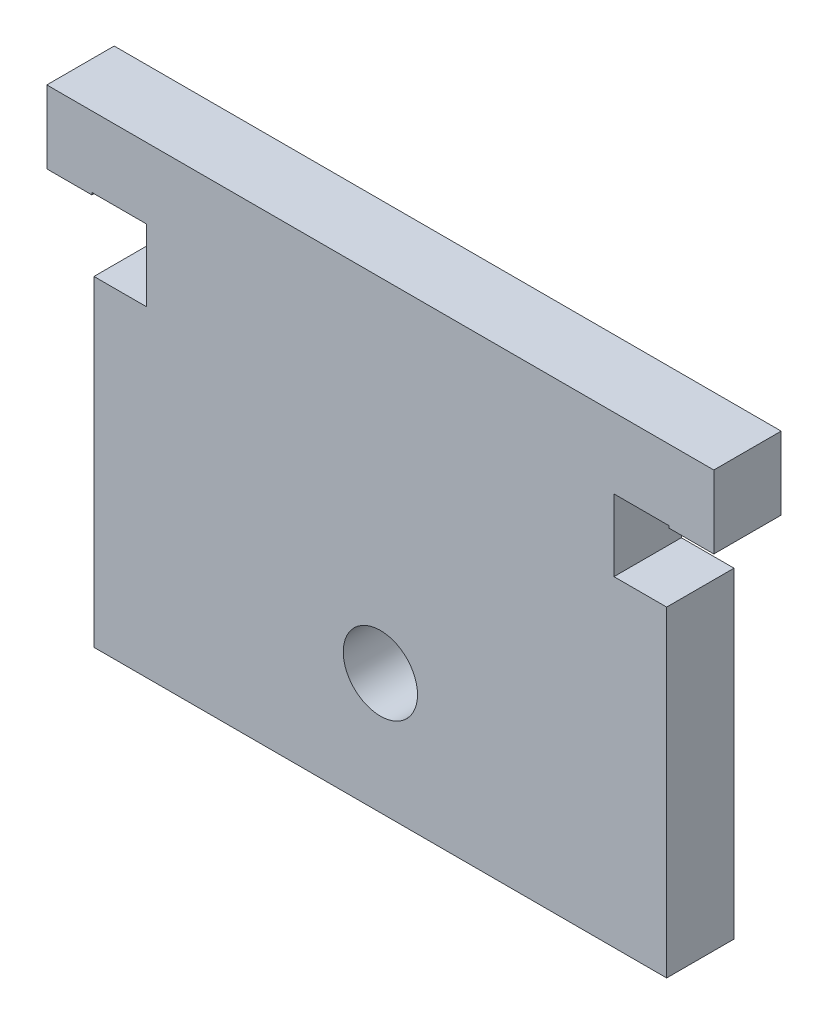
ISO-10303-21;
HEADER;
FILE_DESCRIPTION(('STEP AP214'),'2;1');
FILE_NAME('part.step','',(''),(''),'','','');
FILE_SCHEMA(('AUTOMOTIVE_DESIGN { 1 0 10303 214 1 1 1 1 }'));
ENDSEC;
DATA;
#1=APPLICATION_CONTEXT('core data for automotive mechanical design processes');
#2=APPLICATION_PROTOCOL_DEFINITION('international standard','automotive_design',2000,#1);
#3=PRODUCT_CONTEXT('',#1,'mechanical');
#4=PRODUCT('Part','Part','',(#3));
#5=PRODUCT_RELATED_PRODUCT_CATEGORY('part','',(#4));
#6=PRODUCT_DEFINITION_FORMATION('','',#4);
#7=PRODUCT_DEFINITION_CONTEXT('part definition',#1,'design');
#8=PRODUCT_DEFINITION('design','',#6,#7);
#9=PRODUCT_DEFINITION_SHAPE('','',#8);
#10=(LENGTH_UNIT() NAMED_UNIT(*) SI_UNIT(.MILLI.,.METRE.));
#11=(NAMED_UNIT(*) PLANE_ANGLE_UNIT() SI_UNIT($,.RADIAN.));
#12=(NAMED_UNIT(*) SI_UNIT($,.STERADIAN.) SOLID_ANGLE_UNIT());
#13=UNCERTAINTY_MEASURE_WITH_UNIT(LENGTH_MEASURE(1.E-05),#10,'distance_accuracy_value','');
#14=(GEOMETRIC_REPRESENTATION_CONTEXT(3) GLOBAL_UNCERTAINTY_ASSIGNED_CONTEXT((#13)) GLOBAL_UNIT_ASSIGNED_CONTEXT((#10,
#11,#12)) REPRESENTATION_CONTEXT('',''));
#15=CARTESIAN_POINT('',(0.,0.,0.));
#16=DIRECTION('',(0.,0.,1.));
#17=DIRECTION('',(1.,0.,0.));
#18=AXIS2_PLACEMENT_3D('',#15,#16,#17);
#19=CARTESIAN_POINT('',(0.,0.,6.35));
#20=DIRECTION('',(0.,0.,-1.));
#21=DIRECTION('',(-1.,0.,0.));
#22=AXIS2_PLACEMENT_3D('',#19,#20,#21);
#23=PLANE('',#22);
#24=CARTESIAN_POINT('',(0.00591999999668975,-7.666260004,6.35));
#25=DIRECTION('',(0.,0.,1.));
#26=DIRECTION('',(1.,0.,0.));
#27=AXIS2_PLACEMENT_3D('',#24,#25,#26);
#28=CIRCLE('',#27,3.49999999999999);
#29=CARTESIAN_POINT('',(3.50591999999668,-7.666260004,6.35));
#30=VERTEX_POINT('',#29);
#31=EDGE_CURVE('E192',#30,#30,#28,.T.);
#32=ORIENTED_EDGE('',*,*,#31,.F.);
#33=EDGE_LOOP('',(#32));
#34=FACE_BOUND('',#33,.T.);
#35=DIRECTION('',(0.,1.,0.));
#36=VECTOR('',#35,1.);
#37=CARTESIAN_POINT('',(-22.0218,17.9832,6.35));
#38=LINE('',#37,#36);
#39=CARTESIAN_POINT('',(-22.0218,11.2268,6.35));
#40=VERTEX_POINT('',#39);
#41=CARTESIAN_POINT('',(-22.0218,17.9832,6.35));
#42=VERTEX_POINT('',#41);
#43=EDGE_CURVE('E162',#40,#42,#38,.T.);
#44=ORIENTED_EDGE('',*,*,#43,.F.);
#45=DIRECTION('',(1.,0.,0.));
#46=VECTOR('',#45,1.);
#47=CARTESIAN_POINT('',(-22.0218,11.2268,6.35));
#48=LINE('',#47,#46);
#49=CARTESIAN_POINT('',(-26.9875,11.2268,6.35));
#50=VERTEX_POINT('',#49);
#51=EDGE_CURVE('E179',#50,#40,#48,.T.);
#52=ORIENTED_EDGE('',*,*,#51,.F.);
#53=DIRECTION('',(0.,1.,0.));
#54=VECTOR('',#53,1.);
#55=CARTESIAN_POINT('',(-26.9875,-25.4,6.35));
#56=LINE('',#55,#54);
#57=CARTESIAN_POINT('',(-26.9875,-19.05,6.35));
#58=VERTEX_POINT('',#57);
#59=EDGE_CURVE('E270',#58,#50,#56,.T.);
#60=ORIENTED_EDGE('',*,*,#59,.F.);
#61=DIRECTION('',(-1.,0.,0.));
#62=VECTOR('',#61,1.);
#63=CARTESIAN_POINT('',(-26.9875,-19.05,6.35));
#64=LINE('',#63,#62);
#65=CARTESIAN_POINT('',(26.9875,-19.05,6.35));
#66=VERTEX_POINT('',#65);
#67=EDGE_CURVE('E233',#66,#58,#64,.T.);
#68=ORIENTED_EDGE('',*,*,#67,.F.);
#69=DIRECTION('',(0.,-1.,0.));
#70=VECTOR('',#69,1.);
#71=CARTESIAN_POINT('',(26.9875,-25.4,6.35));
#72=LINE('',#71,#70);
#73=CARTESIAN_POINT('',(26.9875,11.2268,6.35));
#74=VERTEX_POINT('',#73);
#75=EDGE_CURVE('E275',#74,#66,#72,.T.);
#76=ORIENTED_EDGE('',*,*,#75,.F.);
#77=DIRECTION('',(1.,0.,0.));
#78=VECTOR('',#77,1.);
#79=CARTESIAN_POINT('',(22.0218,11.2268,6.35));
#80=LINE('',#79,#78);
#81=CARTESIAN_POINT('',(22.0218,11.2268,6.35));
#82=VERTEX_POINT('',#81);
#83=EDGE_CURVE('E203',#82,#74,#80,.T.);
#84=ORIENTED_EDGE('',*,*,#83,.F.);
#85=DIRECTION('',(0.,-1.,0.));
#86=VECTOR('',#85,1.);
#87=CARTESIAN_POINT('',(22.0218,17.9832,6.35));
#88=LINE('',#87,#86);
#89=CARTESIAN_POINT('',(22.0218,17.9832,6.35));
#90=VERTEX_POINT('',#89);
#91=EDGE_CURVE('E206',#90,#82,#88,.T.);
#92=ORIENTED_EDGE('',*,*,#91,.F.);
#93=DIRECTION('',(-1.,0.,0.));
#94=VECTOR('',#93,1.);
#95=CARTESIAN_POINT('',(22.0218,17.9832,6.35));
#96=LINE('',#95,#94);
#97=CARTESIAN_POINT('',(27.1907,17.9832,6.35));
#98=VERTEX_POINT('',#97);
#99=EDGE_CURVE('E187',#98,#90,#96,.T.);
#100=ORIENTED_EDGE('',*,*,#99,.F.);
#101=DIRECTION('',(0.,1.,0.));
#102=VECTOR('',#101,1.);
#103=CARTESIAN_POINT('',(27.1907,17.9832,6.35));
#104=LINE('',#103,#102);
#105=CARTESIAN_POINT('',(27.1907,17.78,6.35));
#106=VERTEX_POINT('',#105);
#107=EDGE_CURVE('E201',#106,#98,#104,.T.);
#108=ORIENTED_EDGE('',*,*,#107,.F.);
#109=DIRECTION('',(-1.,0.,0.));
#110=VECTOR('',#109,1.);
#111=CARTESIAN_POINT('',(42.8625,17.78,6.35));
#112=LINE('',#111,#110);
#113=CARTESIAN_POINT('',(31.4325,17.78,6.35));
#114=VERTEX_POINT('',#113);
#115=EDGE_CURVE('E273',#114,#106,#112,.T.);
#116=ORIENTED_EDGE('',*,*,#115,.F.);
#117=DIRECTION('',(0.,1.,0.));
#118=VECTOR('',#117,1.);
#119=CARTESIAN_POINT('',(31.4325,24.638,6.35));
#120=LINE('',#119,#118);
#121=CARTESIAN_POINT('',(31.4325,24.638,6.35));
#122=VERTEX_POINT('',#121);
#123=EDGE_CURVE('E241',#114,#122,#120,.T.);
#124=ORIENTED_EDGE('',*,*,#123,.T.);
#125=DIRECTION('',(1.,0.,0.));
#126=VECTOR('',#125,1.);
#127=CARTESIAN_POINT('',(-42.8625,24.638,6.35));
#128=LINE('',#127,#126);
#129=CARTESIAN_POINT('',(-31.4325,24.638,6.35));
#130=VERTEX_POINT('',#129);
#131=EDGE_CURVE('E258',#130,#122,#128,.T.);
#132=ORIENTED_EDGE('',*,*,#131,.F.);
#133=DIRECTION('',(0.,1.,0.));
#134=VECTOR('',#133,1.);
#135=CARTESIAN_POINT('',(-31.4325,24.638,6.35));
#136=LINE('',#135,#134);
#137=CARTESIAN_POINT('',(-31.4325,17.78,6.35));
#138=VERTEX_POINT('',#137);
#139=EDGE_CURVE('E253',#138,#130,#136,.T.);
#140=ORIENTED_EDGE('',*,*,#139,.F.);
#141=DIRECTION('',(-1.,0.,0.));
#142=VECTOR('',#141,1.);
#143=CARTESIAN_POINT('',(-42.8625,17.78,6.35));
#144=LINE('',#143,#142);
#145=CARTESIAN_POINT('',(-27.1907,17.78,6.35));
#146=VERTEX_POINT('',#145);
#147=EDGE_CURVE('E267',#146,#138,#144,.T.);
#148=ORIENTED_EDGE('',*,*,#147,.F.);
#149=DIRECTION('',(0.,-1.,0.));
#150=VECTOR('',#149,1.);
#151=CARTESIAN_POINT('',(-27.1907,17.9832,6.35));
#152=LINE('',#151,#150);
#153=CARTESIAN_POINT('',(-27.1907,17.9832,6.35));
#154=VERTEX_POINT('',#153);
#155=EDGE_CURVE('E64',#154,#146,#152,.T.);
#156=ORIENTED_EDGE('',*,*,#155,.F.);
#157=DIRECTION('',(-1.,0.,0.));
#158=VECTOR('',#157,1.);
#159=CARTESIAN_POINT('',(-22.0218,17.9832,6.35));
#160=LINE('',#159,#158);
#161=EDGE_CURVE('E186',#42,#154,#160,.T.);
#162=ORIENTED_EDGE('',*,*,#161,.F.);
#163=EDGE_LOOP('',(#44,#52,#60,#68,#76,#84,#92,#100,#108,#116,#124,#132,#140,#148,#156,#162));
#164=FACE_BOUND('',#163,.T.);
#165=ADVANCED_FACE('F41',(#34,#164),#23,.F.);
#166=CARTESIAN_POINT('',(0.,0.,0.));
#167=DIRECTION('',(0.,0.,-1.));
#168=DIRECTION('',(-1.,0.,0.));
#169=AXIS2_PLACEMENT_3D('',#166,#167,#168);
#170=PLANE('',#169);
#171=DIRECTION('',(1.,0.,0.));
#172=VECTOR('',#171,1.);
#173=CARTESIAN_POINT('',(-22.0218,11.2268,0.));
#174=LINE('',#173,#172);
#175=CARTESIAN_POINT('',(-26.9875,11.2268,0.));
#176=VERTEX_POINT('',#175);
#177=CARTESIAN_POINT('',(-22.0218,11.2268,0.));
#178=VERTEX_POINT('',#177);
#179=EDGE_CURVE('E167',#176,#178,#174,.T.);
#180=ORIENTED_EDGE('',*,*,#179,.T.);
#181=DIRECTION('',(0.,1.,0.));
#182=VECTOR('',#181,1.);
#183=CARTESIAN_POINT('',(-22.0218,17.9832,0.));
#184=LINE('',#183,#182);
#185=CARTESIAN_POINT('',(-22.0218,17.9832,0.));
#186=VERTEX_POINT('',#185);
#187=EDGE_CURVE('E159',#178,#186,#184,.T.);
#188=ORIENTED_EDGE('',*,*,#187,.T.);
#189=DIRECTION('',(-1.,0.,0.));
#190=VECTOR('',#189,1.);
#191=CARTESIAN_POINT('',(-22.0218,17.9832,0.));
#192=LINE('',#191,#190);
#193=CARTESIAN_POINT('',(-27.1907,17.9832,0.));
#194=VERTEX_POINT('',#193);
#195=EDGE_CURVE('E170',#186,#194,#192,.T.);
#196=ORIENTED_EDGE('',*,*,#195,.T.);
#197=DIRECTION('',(0.,-1.,0.));
#198=VECTOR('',#197,1.);
#199=CARTESIAN_POINT('',(-27.1907,17.9832,0.));
#200=LINE('',#199,#198);
#201=CARTESIAN_POINT('',(-27.1907,17.78,0.));
#202=VERTEX_POINT('',#201);
#203=EDGE_CURVE('E175',#194,#202,#200,.T.);
#204=ORIENTED_EDGE('',*,*,#203,.T.);
#205=DIRECTION('',(-1.,0.,0.));
#206=VECTOR('',#205,1.);
#207=CARTESIAN_POINT('',(-42.8625,17.78,0.));
#208=LINE('',#207,#206);
#209=CARTESIAN_POINT('',(-31.4325,17.78,0.));
#210=VERTEX_POINT('',#209);
#211=EDGE_CURVE('E266',#202,#210,#208,.T.);
#212=ORIENTED_EDGE('',*,*,#211,.T.);
#213=DIRECTION('',(0.,-1.,0.));
#214=VECTOR('',#213,1.);
#215=CARTESIAN_POINT('',(-31.4325,24.638,0.));
#216=LINE('',#215,#214);
#217=CARTESIAN_POINT('',(-31.4325,24.638,0.));
#218=VERTEX_POINT('',#217);
#219=EDGE_CURVE('E247',#218,#210,#216,.T.);
#220=ORIENTED_EDGE('',*,*,#219,.F.);
#221=DIRECTION('',(-1.,0.,0.));
#222=VECTOR('',#221,1.);
#223=CARTESIAN_POINT('',(-42.8625,24.638,0.));
#224=LINE('',#223,#222);
#225=CARTESIAN_POINT('',(31.4325,24.638,0.));
#226=VERTEX_POINT('',#225);
#227=EDGE_CURVE('E261',#226,#218,#224,.T.);
#228=ORIENTED_EDGE('',*,*,#227,.F.);
#229=DIRECTION('',(0.,-1.,0.));
#230=VECTOR('',#229,1.);
#231=CARTESIAN_POINT('',(31.4325,24.638,0.));
#232=LINE('',#231,#230);
#233=CARTESIAN_POINT('',(31.4325,17.78,0.));
#234=VERTEX_POINT('',#233);
#235=EDGE_CURVE('E235',#226,#234,#232,.T.);
#236=ORIENTED_EDGE('',*,*,#235,.T.);
#237=DIRECTION('',(-1.,0.,0.));
#238=VECTOR('',#237,1.);
#239=CARTESIAN_POINT('',(42.8625,17.78,0.));
#240=LINE('',#239,#238);
#241=CARTESIAN_POINT('',(27.1907,17.78,0.));
#242=VERTEX_POINT('',#241);
#243=EDGE_CURVE('E277',#234,#242,#240,.T.);
#244=ORIENTED_EDGE('',*,*,#243,.T.);
#245=DIRECTION('',(0.,1.,0.));
#246=VECTOR('',#245,1.);
#247=CARTESIAN_POINT('',(27.1907,17.9832,0.));
#248=LINE('',#247,#246);
#249=CARTESIAN_POINT('',(27.1907,17.9832,0.));
#250=VERTEX_POINT('',#249);
#251=EDGE_CURVE('E56',#242,#250,#248,.T.);
#252=ORIENTED_EDGE('',*,*,#251,.T.);
#253=DIRECTION('',(-1.,0.,0.));
#254=VECTOR('',#253,1.);
#255=CARTESIAN_POINT('',(22.0218,17.9832,0.));
#256=LINE('',#255,#254);
#257=CARTESIAN_POINT('',(22.0218,17.9832,0.));
#258=VERTEX_POINT('',#257);
#259=EDGE_CURVE('E204',#250,#258,#256,.T.);
#260=ORIENTED_EDGE('',*,*,#259,.T.);
#261=DIRECTION('',(0.,-1.,0.));
#262=VECTOR('',#261,1.);
#263=CARTESIAN_POINT('',(22.0218,17.9832,0.));
#264=LINE('',#263,#262);
#265=CARTESIAN_POINT('',(22.0218,11.2268,0.));
#266=VERTEX_POINT('',#265);
#267=EDGE_CURVE('E215',#258,#266,#264,.T.);
#268=ORIENTED_EDGE('',*,*,#267,.T.);
#269=DIRECTION('',(1.,0.,0.));
#270=VECTOR('',#269,1.);
#271=CARTESIAN_POINT('',(22.0218,11.2268,0.));
#272=LINE('',#271,#270);
#273=CARTESIAN_POINT('',(26.9875,11.2268,0.));
#274=VERTEX_POINT('',#273);
#275=EDGE_CURVE('E212',#266,#274,#272,.T.);
#276=ORIENTED_EDGE('',*,*,#275,.T.);
#277=DIRECTION('',(0.,-1.,0.));
#278=VECTOR('',#277,1.);
#279=CARTESIAN_POINT('',(26.9875,-25.4,0.));
#280=LINE('',#279,#278);
#281=CARTESIAN_POINT('',(26.9875,-19.05,0.));
#282=VERTEX_POINT('',#281);
#283=EDGE_CURVE('E263',#274,#282,#280,.T.);
#284=ORIENTED_EDGE('',*,*,#283,.T.);
#285=DIRECTION('',(1.,0.,0.));
#286=VECTOR('',#285,1.);
#287=CARTESIAN_POINT('',(-26.9875,-19.05,0.));
#288=LINE('',#287,#286);
#289=CARTESIAN_POINT('',(-26.9875,-19.05,0.));
#290=VERTEX_POINT('',#289);
#291=EDGE_CURVE('E227',#290,#282,#288,.T.);
#292=ORIENTED_EDGE('',*,*,#291,.F.);
#293=DIRECTION('',(0.,1.,0.));
#294=VECTOR('',#293,1.);
#295=CARTESIAN_POINT('',(-26.9875,-25.4,0.));
#296=LINE('',#295,#294);
#297=EDGE_CURVE('E264',#290,#176,#296,.T.);
#298=ORIENTED_EDGE('',*,*,#297,.T.);
#299=EDGE_LOOP('',(#180,#188,#196,#204,#212,#220,#228,#236,#244,#252,#260,#268,#276,#284,#292,#298));
#300=FACE_BOUND('',#299,.T.);
#301=CARTESIAN_POINT('',(0.00591999999668975,-7.666260004,0.));
#302=DIRECTION('',(0.,0.,1.));
#303=DIRECTION('',(1.,0.,0.));
#304=AXIS2_PLACEMENT_3D('',#301,#302,#303);
#305=CIRCLE('',#304,3.5);
#306=CARTESIAN_POINT('',(3.50591999999669,-7.666260004,0.));
#307=VERTEX_POINT('',#306);
#308=EDGE_CURVE('E222',#307,#307,#305,.T.);
#309=ORIENTED_EDGE('',*,*,#308,.T.);
#310=EDGE_LOOP('',(#309));
#311=FACE_BOUND('',#310,.T.);
#312=ADVANCED_FACE('F43',(#300,#311),#170,.T.);
#313=CARTESIAN_POINT('',(26.9875,-25.4,0.));
#314=DIRECTION('',(-1.,0.,0.));
#315=DIRECTION('',(0.,0.,1.));
#316=AXIS2_PLACEMENT_3D('',#313,#314,#315);
#317=PLANE('',#316);
#318=ORIENTED_EDGE('',*,*,#283,.F.);
#319=DIRECTION('',(0.,0.,1.));
#320=VECTOR('',#319,1.);
#321=CARTESIAN_POINT('',(26.9875,11.2268,0.));
#322=LINE('',#321,#320);
#323=EDGE_CURVE('E11',#274,#74,#322,.T.);
#324=ORIENTED_EDGE('',*,*,#323,.T.);
#325=ORIENTED_EDGE('',*,*,#75,.T.);
#326=DIRECTION('',(0.,0.,1.));
#327=VECTOR('',#326,1.);
#328=CARTESIAN_POINT('',(26.9875,-19.05,6.35));
#329=LINE('',#328,#327);
#330=EDGE_CURVE('E230',#282,#66,#329,.T.);
#331=ORIENTED_EDGE('',*,*,#330,.F.);
#332=EDGE_LOOP('',(#318,#324,#325,#331));
#333=FACE_BOUND('',#332,.T.);
#334=ADVANCED_FACE('F300',(#333),#317,.F.);
#335=CARTESIAN_POINT('',(-26.9875,-25.4,0.));
#336=DIRECTION('',(1.,0.,0.));
#337=DIRECTION('',(0.,0.,-1.));
#338=AXIS2_PLACEMENT_3D('',#335,#336,#337);
#339=PLANE('',#338);
#340=ORIENTED_EDGE('',*,*,#59,.T.);
#341=DIRECTION('',(0.,0.,-1.));
#342=VECTOR('',#341,1.);
#343=CARTESIAN_POINT('',(-26.9875,11.2268,0.));
#344=LINE('',#343,#342);
#345=EDGE_CURVE('E49',#50,#176,#344,.T.);
#346=ORIENTED_EDGE('',*,*,#345,.T.);
#347=ORIENTED_EDGE('',*,*,#297,.F.);
#348=DIRECTION('',(0.,0.,-1.));
#349=VECTOR('',#348,1.);
#350=CARTESIAN_POINT('',(-26.9875,-19.05,6.35));
#351=LINE('',#350,#349);
#352=EDGE_CURVE('E225',#58,#290,#351,.T.);
#353=ORIENTED_EDGE('',*,*,#352,.F.);
#354=EDGE_LOOP('',(#340,#346,#347,#353));
#355=FACE_BOUND('',#354,.T.);
#356=ADVANCED_FACE('F288',(#355),#339,.F.);
#357=CARTESIAN_POINT('',(0.,24.638,0.));
#358=DIRECTION('',(0.,1.,0.));
#359=DIRECTION('',(0.,0.,1.));
#360=AXIS2_PLACEMENT_3D('',#357,#358,#359);
#361=PLANE('',#360);
#362=ORIENTED_EDGE('',*,*,#131,.T.);
#363=DIRECTION('',(0.,0.,-1.));
#364=VECTOR('',#363,1.);
#365=CARTESIAN_POINT('',(31.4325,24.638,0.));
#366=LINE('',#365,#364);
#367=EDGE_CURVE('E238',#122,#226,#366,.T.);
#368=ORIENTED_EDGE('',*,*,#367,.T.);
#369=ORIENTED_EDGE('',*,*,#227,.T.);
#370=DIRECTION('',(0.,0.,-1.));
#371=VECTOR('',#370,1.);
#372=CARTESIAN_POINT('',(-31.4325,24.638,0.));
#373=LINE('',#372,#371);
#374=EDGE_CURVE('E255',#130,#218,#373,.T.);
#375=ORIENTED_EDGE('',*,*,#374,.F.);
#376=EDGE_LOOP('',(#362,#368,#369,#375));
#377=FACE_BOUND('',#376,.T.);
#378=ADVANCED_FACE('F331',(#377),#361,.T.);
#379=CARTESIAN_POINT('',(42.8625,17.78,0.));
#380=DIRECTION('',(0.,1.,0.));
#381=DIRECTION('',(-1.,0.,0.));
#382=AXIS2_PLACEMENT_3D('',#379,#380,#381);
#383=PLANE('',#382);
#384=ORIENTED_EDGE('',*,*,#115,.T.);
#385=DIRECTION('',(0.,0.,-1.));
#386=VECTOR('',#385,1.);
#387=CARTESIAN_POINT('',(27.1907,17.78,0.));
#388=LINE('',#387,#386);
#389=EDGE_CURVE('E284',#106,#242,#388,.T.);
#390=ORIENTED_EDGE('',*,*,#389,.T.);
#391=ORIENTED_EDGE('',*,*,#243,.F.);
#392=DIRECTION('',(0.,0.,1.));
#393=VECTOR('',#392,1.);
#394=CARTESIAN_POINT('',(31.4325,17.78,0.));
#395=LINE('',#394,#393);
#396=EDGE_CURVE('E244',#234,#114,#395,.T.);
#397=ORIENTED_EDGE('',*,*,#396,.T.);
#398=EDGE_LOOP('',(#384,#390,#391,#397));
#399=FACE_BOUND('',#398,.T.);
#400=ADVANCED_FACE('F327',(#399),#383,.F.);
#401=CARTESIAN_POINT('',(-42.8625,17.78,0.));
#402=DIRECTION('',(0.,1.,0.));
#403=DIRECTION('',(0.,0.,1.));
#404=AXIS2_PLACEMENT_3D('',#401,#402,#403);
#405=PLANE('',#404);
#406=ORIENTED_EDGE('',*,*,#211,.F.);
#407=DIRECTION('',(0.,0.,1.));
#408=VECTOR('',#407,1.);
#409=CARTESIAN_POINT('',(-27.1907,17.78,0.));
#410=LINE('',#409,#408);
#411=EDGE_CURVE('E269',#202,#146,#410,.T.);
#412=ORIENTED_EDGE('',*,*,#411,.T.);
#413=ORIENTED_EDGE('',*,*,#147,.T.);
#414=DIRECTION('',(0.,0.,1.));
#415=VECTOR('',#414,1.);
#416=CARTESIAN_POINT('',(-31.4325,17.78,0.));
#417=LINE('',#416,#415);
#418=EDGE_CURVE('E250',#210,#138,#417,.T.);
#419=ORIENTED_EDGE('',*,*,#418,.F.);
#420=EDGE_LOOP('',(#406,#412,#413,#419));
#421=FACE_BOUND('',#420,.T.);
#422=ADVANCED_FACE('F330',(#421),#405,.F.);
#423=CARTESIAN_POINT('',(-31.4325,0.,0.));
#424=DIRECTION('',(-1.,0.,0.));
#425=DIRECTION('',(0.,0.,1.));
#426=AXIS2_PLACEMENT_3D('',#423,#424,#425);
#427=PLANE('',#426);
#428=ORIENTED_EDGE('',*,*,#219,.T.);
#429=ORIENTED_EDGE('',*,*,#418,.T.);
#430=ORIENTED_EDGE('',*,*,#139,.T.);
#431=ORIENTED_EDGE('',*,*,#374,.T.);
#432=EDGE_LOOP('',(#428,#429,#430,#431));
#433=FACE_BOUND('',#432,.T.);
#434=ADVANCED_FACE('F336',(#433),#427,.T.);
#435=CARTESIAN_POINT('',(31.4325,0.,0.));
#436=DIRECTION('',(1.,0.,0.));
#437=DIRECTION('',(0.,0.,1.));
#438=AXIS2_PLACEMENT_3D('',#435,#436,#437);
#439=PLANE('',#438);
#440=ORIENTED_EDGE('',*,*,#235,.F.);
#441=ORIENTED_EDGE('',*,*,#367,.F.);
#442=ORIENTED_EDGE('',*,*,#123,.F.);
#443=ORIENTED_EDGE('',*,*,#396,.F.);
#444=EDGE_LOOP('',(#440,#441,#442,#443));
#445=FACE_BOUND('',#444,.T.);
#446=ADVANCED_FACE('F343',(#445),#439,.T.);
#447=CARTESIAN_POINT('',(0.,-19.05,0.));
#448=DIRECTION('',(0.,-1.,0.));
#449=DIRECTION('',(0.,0.,-1.));
#450=AXIS2_PLACEMENT_3D('',#447,#448,#449);
#451=PLANE('',#450);
#452=ORIENTED_EDGE('',*,*,#352,.T.);
#453=ORIENTED_EDGE('',*,*,#291,.T.);
#454=ORIENTED_EDGE('',*,*,#330,.T.);
#455=ORIENTED_EDGE('',*,*,#67,.T.);
#456=EDGE_LOOP('',(#452,#453,#454,#455));
#457=FACE_BOUND('',#456,.T.);
#458=ADVANCED_FACE('F297',(#457),#451,.T.);
#459=CARTESIAN_POINT('',(0.00591999999668975,-7.666260004,6.35));
#460=DIRECTION('',(0.,0.,1.));
#461=DIRECTION('',(1.,0.,0.));
#462=AXIS2_PLACEMENT_3D('',#459,#460,#461);
#463=CYLINDRICAL_SURFACE('',#462,3.49999999999999);
#464=ORIENTED_EDGE('',*,*,#308,.F.);
#465=EDGE_LOOP('',(#464));
#466=FACE_BOUND('',#465,.T.);
#467=ORIENTED_EDGE('',*,*,#31,.T.);
#468=EDGE_LOOP('',(#467));
#469=FACE_BOUND('',#468,.T.);
#470=ADVANCED_FACE('F308',(#466,#469),#463,.F.);
#471=CARTESIAN_POINT('',(-22.0218,11.2268,0.));
#472=DIRECTION('',(0.,-1.,0.));
#473=DIRECTION('',(0.,0.,-1.));
#474=AXIS2_PLACEMENT_3D('',#471,#472,#473);
#475=PLANE('',#474);
#476=ORIENTED_EDGE('',*,*,#51,.T.);
#477=DIRECTION('',(0.,0.,1.));
#478=VECTOR('',#477,1.);
#479=CARTESIAN_POINT('',(-22.0218,11.2268,0.));
#480=LINE('',#479,#478);
#481=EDGE_CURVE('E190',#178,#40,#480,.T.);
#482=ORIENTED_EDGE('',*,*,#481,.F.);
#483=ORIENTED_EDGE('',*,*,#179,.F.);
#484=ORIENTED_EDGE('',*,*,#345,.F.);
#485=EDGE_LOOP('',(#476,#482,#483,#484));
#486=FACE_BOUND('',#485,.T.);
#487=ADVANCED_FACE('F305',(#486),#475,.F.);
#488=CARTESIAN_POINT('',(-27.1907,17.9832,0.));
#489=DIRECTION('',(-1.,0.,0.));
#490=DIRECTION('',(0.,0.,1.));
#491=AXIS2_PLACEMENT_3D('',#488,#489,#490);
#492=PLANE('',#491);
#493=ORIENTED_EDGE('',*,*,#203,.F.);
#494=DIRECTION('',(0.,0.,1.));
#495=VECTOR('',#494,1.);
#496=CARTESIAN_POINT('',(-27.1907,17.9832,0.));
#497=LINE('',#496,#495);
#498=EDGE_CURVE('E166',#194,#154,#497,.T.);
#499=ORIENTED_EDGE('',*,*,#498,.T.);
#500=ORIENTED_EDGE('',*,*,#155,.T.);
#501=ORIENTED_EDGE('',*,*,#411,.F.);
#502=EDGE_LOOP('',(#493,#499,#500,#501));
#503=FACE_BOUND('',#502,.T.);
#504=ADVANCED_FACE('F307',(#503),#492,.F.);
#505=CARTESIAN_POINT('',(-22.0218,17.9832,0.));
#506=DIRECTION('',(1.,0.,0.));
#507=DIRECTION('',(0.,0.,-1.));
#508=AXIS2_PLACEMENT_3D('',#505,#506,#507);
#509=PLANE('',#508);
#510=ORIENTED_EDGE('',*,*,#43,.T.);
#511=DIRECTION('',(0.,0.,1.));
#512=VECTOR('',#511,1.);
#513=CARTESIAN_POINT('',(-22.0218,17.9832,0.));
#514=LINE('',#513,#512);
#515=EDGE_CURVE('E154',#186,#42,#514,.T.);
#516=ORIENTED_EDGE('',*,*,#515,.F.);
#517=ORIENTED_EDGE('',*,*,#187,.F.);
#518=ORIENTED_EDGE('',*,*,#481,.T.);
#519=EDGE_LOOP('',(#510,#516,#517,#518));
#520=FACE_BOUND('',#519,.T.);
#521=ADVANCED_FACE('F156',(#520),#509,.F.);
#522=CARTESIAN_POINT('',(-22.0218,17.9832,0.));
#523=DIRECTION('',(0.,1.,0.));
#524=DIRECTION('',(0.,0.,1.));
#525=AXIS2_PLACEMENT_3D('',#522,#523,#524);
#526=PLANE('',#525);
#527=ORIENTED_EDGE('',*,*,#161,.T.);
#528=ORIENTED_EDGE('',*,*,#498,.F.);
#529=ORIENTED_EDGE('',*,*,#195,.F.);
#530=ORIENTED_EDGE('',*,*,#515,.T.);
#531=EDGE_LOOP('',(#527,#528,#529,#530));
#532=FACE_BOUND('',#531,.T.);
#533=ADVANCED_FACE('F171',(#532),#526,.F.);
#534=CARTESIAN_POINT('',(22.0218,11.2268,0.));
#535=DIRECTION('',(0.,-1.,0.));
#536=DIRECTION('',(0.,0.,-1.));
#537=AXIS2_PLACEMENT_3D('',#534,#535,#536);
#538=PLANE('',#537);
#539=ORIENTED_EDGE('',*,*,#275,.F.);
#540=DIRECTION('',(0.,0.,1.));
#541=VECTOR('',#540,1.);
#542=CARTESIAN_POINT('',(22.0218,11.2268,0.));
#543=LINE('',#542,#541);
#544=EDGE_CURVE('E196',#266,#82,#543,.T.);
#545=ORIENTED_EDGE('',*,*,#544,.T.);
#546=ORIENTED_EDGE('',*,*,#83,.T.);
#547=ORIENTED_EDGE('',*,*,#323,.F.);
#548=EDGE_LOOP('',(#539,#545,#546,#547));
#549=FACE_BOUND('',#548,.T.);
#550=ADVANCED_FACE('F354',(#549),#538,.F.);
#551=CARTESIAN_POINT('',(27.1907,17.9832,0.));
#552=DIRECTION('',(1.,0.,0.));
#553=DIRECTION('',(0.,0.,-1.));
#554=AXIS2_PLACEMENT_3D('',#551,#552,#553);
#555=PLANE('',#554);
#556=ORIENTED_EDGE('',*,*,#107,.T.);
#557=DIRECTION('',(0.,0.,1.));
#558=VECTOR('',#557,1.);
#559=CARTESIAN_POINT('',(27.1907,17.9832,0.));
#560=LINE('',#559,#558);
#561=EDGE_CURVE('E198',#250,#98,#560,.T.);
#562=ORIENTED_EDGE('',*,*,#561,.F.);
#563=ORIENTED_EDGE('',*,*,#251,.F.);
#564=ORIENTED_EDGE('',*,*,#389,.F.);
#565=EDGE_LOOP('',(#556,#562,#563,#564));
#566=FACE_BOUND('',#565,.T.);
#567=ADVANCED_FACE('F350',(#566),#555,.F.);
#568=CARTESIAN_POINT('',(22.0218,17.9832,0.));
#569=DIRECTION('',(0.,1.,0.));
#570=DIRECTION('',(0.,0.,1.));
#571=AXIS2_PLACEMENT_3D('',#568,#569,#570);
#572=PLANE('',#571);
#573=ORIENTED_EDGE('',*,*,#99,.T.);
#574=DIRECTION('',(0.,0.,1.));
#575=VECTOR('',#574,1.);
#576=CARTESIAN_POINT('',(22.0218,17.9832,0.));
#577=LINE('',#576,#575);
#578=EDGE_CURVE('E194',#258,#90,#577,.T.);
#579=ORIENTED_EDGE('',*,*,#578,.F.);
#580=ORIENTED_EDGE('',*,*,#259,.F.);
#581=ORIENTED_EDGE('',*,*,#561,.T.);
#582=EDGE_LOOP('',(#573,#579,#580,#581));
#583=FACE_BOUND('',#582,.T.);
#584=ADVANCED_FACE('F353',(#583),#572,.F.);
#585=CARTESIAN_POINT('',(22.0218,17.9832,0.));
#586=DIRECTION('',(-1.,0.,0.));
#587=DIRECTION('',(0.,0.,1.));
#588=AXIS2_PLACEMENT_3D('',#585,#586,#587);
#589=PLANE('',#588);
#590=ORIENTED_EDGE('',*,*,#91,.T.);
#591=ORIENTED_EDGE('',*,*,#544,.F.);
#592=ORIENTED_EDGE('',*,*,#267,.F.);
#593=ORIENTED_EDGE('',*,*,#578,.T.);
#594=EDGE_LOOP('',(#590,#591,#592,#593));
#595=FACE_BOUND('',#594,.T.);
#596=ADVANCED_FACE('F358',(#595),#589,.F.);
#597=CLOSED_SHELL('',(#165,#312,#334,#356,#378,#400,#422,#434,#446,#458,#470,#487,#504,#521,
#533,#550,#567,#584,#596));
#598=MANIFOLD_SOLID_BREP('B2',#597);
#599=ADVANCED_BREP_SHAPE_REPRESENTATION('',(#18,#598),#14);
#600=SHAPE_DEFINITION_REPRESENTATION(#9,#599);
ENDSEC;
END-ISO-10303-21;
